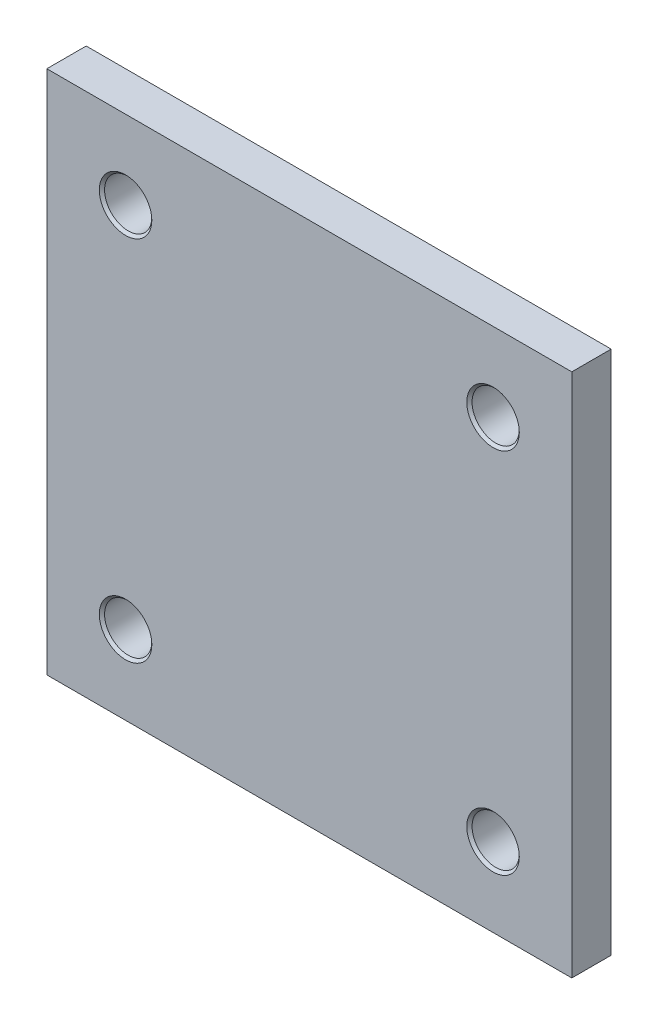
ISO-10303-21;
HEADER;
FILE_DESCRIPTION(('STEP AP214'),'2;1');
FILE_NAME('part.step','',(''),(''),'','','');
FILE_SCHEMA(('AUTOMOTIVE_DESIGN { 1 0 10303 214 1 1 1 1 }'));
ENDSEC;
DATA;
#1=APPLICATION_CONTEXT('core data for automotive mechanical design processes');
#2=APPLICATION_PROTOCOL_DEFINITION('international standard','automotive_design',2000,#1);
#3=PRODUCT_CONTEXT('',#1,'mechanical');
#4=PRODUCT('Part','Part','',(#3));
#5=PRODUCT_RELATED_PRODUCT_CATEGORY('part','',(#4));
#6=PRODUCT_DEFINITION_FORMATION('','',#4);
#7=PRODUCT_DEFINITION_CONTEXT('part definition',#1,'design');
#8=PRODUCT_DEFINITION('design','',#6,#7);
#9=PRODUCT_DEFINITION_SHAPE('','',#8);
#10=(LENGTH_UNIT() NAMED_UNIT(*) SI_UNIT(.MILLI.,.METRE.));
#11=(NAMED_UNIT(*) PLANE_ANGLE_UNIT() SI_UNIT($,.RADIAN.));
#12=(NAMED_UNIT(*) SI_UNIT($,.STERADIAN.) SOLID_ANGLE_UNIT());
#13=UNCERTAINTY_MEASURE_WITH_UNIT(LENGTH_MEASURE(1.E-05),#10,'distance_accuracy_value','');
#14=(GEOMETRIC_REPRESENTATION_CONTEXT(3) GLOBAL_UNCERTAINTY_ASSIGNED_CONTEXT((#13)) GLOBAL_UNIT_ASSIGNED_CONTEXT((#10,
#11,#12)) REPRESENTATION_CONTEXT('',''));
#15=CARTESIAN_POINT('',(0.,0.,0.));
#16=DIRECTION('',(0.,0.,1.));
#17=DIRECTION('',(1.,0.,0.));
#18=AXIS2_PLACEMENT_3D('',#15,#16,#17);
#19=CARTESIAN_POINT('',(200.,-200.,30.));
#20=DIRECTION('',(-1.,0.,0.));
#21=DIRECTION('',(0.,0.,1.));
#22=AXIS2_PLACEMENT_3D('',#19,#20,#21);
#23=PLANE('',#22);
#24=DIRECTION('',(0.,1.,0.));
#25=VECTOR('',#24,1.);
#26=CARTESIAN_POINT('',(200.,-200.,0.));
#27=LINE('',#26,#25);
#28=CARTESIAN_POINT('',(200.,-200.,0.));
#29=VERTEX_POINT('',#28);
#30=CARTESIAN_POINT('',(200.,200.,0.));
#31=VERTEX_POINT('',#30);
#32=EDGE_CURVE('E95',#29,#31,#27,.T.);
#33=ORIENTED_EDGE('',*,*,#32,.T.);
#34=DIRECTION('',(0.,0.,-1.));
#35=VECTOR('',#34,1.);
#36=CARTESIAN_POINT('',(200.,200.,30.));
#37=LINE('',#36,#35);
#38=CARTESIAN_POINT('',(200.,200.,30.));
#39=VERTEX_POINT('',#38);
#40=EDGE_CURVE('E11',#39,#31,#37,.T.);
#41=ORIENTED_EDGE('',*,*,#40,.F.);
#42=DIRECTION('',(0.,1.,0.));
#43=VECTOR('',#42,1.);
#44=CARTESIAN_POINT('',(200.,-200.,30.));
#45=LINE('',#44,#43);
#46=CARTESIAN_POINT('',(200.,-200.,30.));
#47=VERTEX_POINT('',#46);
#48=EDGE_CURVE('E83',#47,#39,#45,.T.);
#49=ORIENTED_EDGE('',*,*,#48,.F.);
#50=DIRECTION('',(0.,0.,-1.));
#51=VECTOR('',#50,1.);
#52=CARTESIAN_POINT('',(200.,-200.,30.));
#53=LINE('',#52,#51);
#54=EDGE_CURVE('E91',#47,#29,#53,.T.);
#55=ORIENTED_EDGE('',*,*,#54,.T.);
#56=EDGE_LOOP('',(#33,#41,#49,#55));
#57=FACE_BOUND('',#56,.T.);
#58=ADVANCED_FACE('F32',(#57),#23,.F.);
#59=CARTESIAN_POINT('',(-200.,200.,30.));
#60=DIRECTION('',(0.,-1.,0.));
#61=DIRECTION('',(0.,0.,-1.));
#62=AXIS2_PLACEMENT_3D('',#59,#60,#61);
#63=PLANE('',#62);
#64=DIRECTION('',(-1.,0.,0.));
#65=VECTOR('',#64,1.);
#66=CARTESIAN_POINT('',(-200.,200.,0.));
#67=LINE('',#66,#65);
#68=CARTESIAN_POINT('',(-200.,200.,0.));
#69=VERTEX_POINT('',#68);
#70=EDGE_CURVE('E87',#31,#69,#67,.T.);
#71=ORIENTED_EDGE('',*,*,#70,.T.);
#72=DIRECTION('',(0.,0.,-1.));
#73=VECTOR('',#72,1.);
#74=CARTESIAN_POINT('',(-200.,200.,30.));
#75=LINE('',#74,#73);
#76=CARTESIAN_POINT('',(-200.,200.,30.));
#77=VERTEX_POINT('',#76);
#78=EDGE_CURVE('E40',#77,#69,#75,.T.);
#79=ORIENTED_EDGE('',*,*,#78,.F.);
#80=DIRECTION('',(-1.,0.,0.));
#81=VECTOR('',#80,1.);
#82=CARTESIAN_POINT('',(-200.,200.,30.));
#83=LINE('',#82,#81);
#84=EDGE_CURVE('E78',#39,#77,#83,.T.);
#85=ORIENTED_EDGE('',*,*,#84,.F.);
#86=ORIENTED_EDGE('',*,*,#40,.T.);
#87=EDGE_LOOP('',(#71,#79,#85,#86));
#88=FACE_BOUND('',#87,.T.);
#89=ADVANCED_FACE('F86',(#88),#63,.F.);
#90=CARTESIAN_POINT('',(-200.,-200.,30.));
#91=DIRECTION('',(1.,0.,0.));
#92=DIRECTION('',(0.,0.,-1.));
#93=AXIS2_PLACEMENT_3D('',#90,#91,#92);
#94=PLANE('',#93);
#95=DIRECTION('',(0.,-1.,0.));
#96=VECTOR('',#95,1.);
#97=CARTESIAN_POINT('',(-200.,-200.,0.));
#98=LINE('',#97,#96);
#99=CARTESIAN_POINT('',(-200.,-200.,0.));
#100=VERTEX_POINT('',#99);
#101=EDGE_CURVE('E65',#69,#100,#98,.T.);
#102=ORIENTED_EDGE('',*,*,#101,.T.);
#103=DIRECTION('',(0.,0.,-1.));
#104=VECTOR('',#103,1.);
#105=CARTESIAN_POINT('',(-200.,-200.,30.));
#106=LINE('',#105,#104);
#107=CARTESIAN_POINT('',(-200.,-200.,30.));
#108=VERTEX_POINT('',#107);
#109=EDGE_CURVE('E88',#108,#100,#106,.T.);
#110=ORIENTED_EDGE('',*,*,#109,.F.);
#111=DIRECTION('',(0.,-1.,0.));
#112=VECTOR('',#111,1.);
#113=CARTESIAN_POINT('',(-200.,-200.,30.));
#114=LINE('',#113,#112);
#115=EDGE_CURVE('E81',#77,#108,#114,.T.);
#116=ORIENTED_EDGE('',*,*,#115,.F.);
#117=ORIENTED_EDGE('',*,*,#78,.T.);
#118=EDGE_LOOP('',(#102,#110,#116,#117));
#119=FACE_BOUND('',#118,.T.);
#120=ADVANCED_FACE('F89',(#119),#94,.F.);
#121=CARTESIAN_POINT('',(-200.,-200.,30.));
#122=DIRECTION('',(0.,1.,0.));
#123=DIRECTION('',(0.,0.,1.));
#124=AXIS2_PLACEMENT_3D('',#121,#122,#123);
#125=PLANE('',#124);
#126=DIRECTION('',(1.,0.,0.));
#127=VECTOR('',#126,1.);
#128=CARTESIAN_POINT('',(-200.,-200.,0.));
#129=LINE('',#128,#127);
#130=EDGE_CURVE('E71',#100,#29,#129,.T.);
#131=ORIENTED_EDGE('',*,*,#130,.T.);
#132=ORIENTED_EDGE('',*,*,#54,.F.);
#133=DIRECTION('',(1.,0.,0.));
#134=VECTOR('',#133,1.);
#135=CARTESIAN_POINT('',(-200.,-200.,30.));
#136=LINE('',#135,#134);
#137=EDGE_CURVE('E48',#108,#47,#136,.T.);
#138=ORIENTED_EDGE('',*,*,#137,.F.);
#139=ORIENTED_EDGE('',*,*,#109,.T.);
#140=EDGE_LOOP('',(#131,#132,#138,#139));
#141=FACE_BOUND('',#140,.T.);
#142=ADVANCED_FACE('F103',(#141),#125,.F.);
#143=CARTESIAN_POINT('',(0.,0.,30.));
#144=DIRECTION('',(0.,0.,-1.));
#145=DIRECTION('',(-1.,0.,0.));
#146=AXIS2_PLACEMENT_3D('',#143,#144,#145);
#147=PLANE('',#146);
#148=CARTESIAN_POINT('',(140.,140.,30.));
#149=DIRECTION('',(0.,0.,1.));
#150=DIRECTION('',(1.,0.,0.));
#151=AXIS2_PLACEMENT_3D('',#148,#149,#150);
#152=CIRCLE('',#151,20.);
#153=CARTESIAN_POINT('',(160.,140.,30.));
#154=VERTEX_POINT('',#153);
#155=EDGE_CURVE('E150',#154,#154,#152,.T.);
#156=ORIENTED_EDGE('',*,*,#155,.F.);
#157=EDGE_LOOP('',(#156));
#158=FACE_BOUND('',#157,.T.);
#159=CARTESIAN_POINT('',(-140.,140.,30.));
#160=DIRECTION('',(0.,0.,1.));
#161=DIRECTION('',(1.,0.,0.));
#162=AXIS2_PLACEMENT_3D('',#159,#160,#161);
#163=CIRCLE('',#162,20.);
#164=CARTESIAN_POINT('',(-120.,140.,30.));
#165=VERTEX_POINT('',#164);
#166=EDGE_CURVE('E138',#165,#165,#163,.T.);
#167=ORIENTED_EDGE('',*,*,#166,.F.);
#168=EDGE_LOOP('',(#167));
#169=FACE_BOUND('',#168,.T.);
#170=CARTESIAN_POINT('',(-140.,-140.,30.));
#171=DIRECTION('',(0.,0.,1.));
#172=DIRECTION('',(1.,0.,0.));
#173=AXIS2_PLACEMENT_3D('',#170,#171,#172);
#174=CIRCLE('',#173,20.);
#175=CARTESIAN_POINT('',(-120.,-140.,30.));
#176=VERTEX_POINT('',#175);
#177=EDGE_CURVE('E126',#176,#176,#174,.T.);
#178=ORIENTED_EDGE('',*,*,#177,.F.);
#179=EDGE_LOOP('',(#178));
#180=FACE_BOUND('',#179,.T.);
#181=CARTESIAN_POINT('',(140.,-140.,30.));
#182=DIRECTION('',(0.,0.,1.));
#183=DIRECTION('',(1.,0.,0.));
#184=AXIS2_PLACEMENT_3D('',#181,#182,#183);
#185=CIRCLE('',#184,20.);
#186=CARTESIAN_POINT('',(160.,-140.,30.));
#187=VERTEX_POINT('',#186);
#188=EDGE_CURVE('E114',#187,#187,#185,.T.);
#189=ORIENTED_EDGE('',*,*,#188,.F.);
#190=EDGE_LOOP('',(#189));
#191=FACE_BOUND('',#190,.T.);
#192=ORIENTED_EDGE('',*,*,#48,.T.);
#193=ORIENTED_EDGE('',*,*,#84,.T.);
#194=ORIENTED_EDGE('',*,*,#115,.T.);
#195=ORIENTED_EDGE('',*,*,#137,.T.);
#196=EDGE_LOOP('',(#192,#193,#194,#195));
#197=FACE_BOUND('',#196,.T.);
#198=ADVANCED_FACE('F79',(#158,#169,#180,#191,#197),#147,.F.);
#199=CARTESIAN_POINT('',(0.,0.,0.));
#200=DIRECTION('',(0.,0.,-1.));
#201=DIRECTION('',(-1.,0.,0.));
#202=AXIS2_PLACEMENT_3D('',#199,#200,#201);
#203=PLANE('',#202);
#204=CARTESIAN_POINT('',(140.,140.,0.));
#205=DIRECTION('',(0.,0.,1.));
#206=DIRECTION('',(1.,0.,0.));
#207=AXIS2_PLACEMENT_3D('',#204,#205,#206);
#208=CIRCLE('',#207,20.);
#209=CARTESIAN_POINT('',(160.,140.,0.));
#210=VERTEX_POINT('',#209);
#211=EDGE_CURVE('E153',#210,#210,#208,.T.);
#212=ORIENTED_EDGE('',*,*,#211,.T.);
#213=EDGE_LOOP('',(#212));
#214=FACE_BOUND('',#213,.T.);
#215=CARTESIAN_POINT('',(-140.,140.,0.));
#216=DIRECTION('',(0.,0.,1.));
#217=DIRECTION('',(1.,0.,0.));
#218=AXIS2_PLACEMENT_3D('',#215,#216,#217);
#219=CIRCLE('',#218,20.);
#220=CARTESIAN_POINT('',(-120.,140.,0.));
#221=VERTEX_POINT('',#220);
#222=EDGE_CURVE('E141',#221,#221,#219,.T.);
#223=ORIENTED_EDGE('',*,*,#222,.T.);
#224=EDGE_LOOP('',(#223));
#225=FACE_BOUND('',#224,.T.);
#226=CARTESIAN_POINT('',(-140.,-140.,0.));
#227=DIRECTION('',(0.,0.,1.));
#228=DIRECTION('',(1.,0.,0.));
#229=AXIS2_PLACEMENT_3D('',#226,#227,#228);
#230=CIRCLE('',#229,20.);
#231=CARTESIAN_POINT('',(-120.,-140.,0.));
#232=VERTEX_POINT('',#231);
#233=EDGE_CURVE('E129',#232,#232,#230,.T.);
#234=ORIENTED_EDGE('',*,*,#233,.T.);
#235=EDGE_LOOP('',(#234));
#236=FACE_BOUND('',#235,.T.);
#237=CARTESIAN_POINT('',(140.,-140.,0.));
#238=DIRECTION('',(0.,0.,1.));
#239=DIRECTION('',(1.,0.,0.));
#240=AXIS2_PLACEMENT_3D('',#237,#238,#239);
#241=CIRCLE('',#240,20.);
#242=CARTESIAN_POINT('',(160.,-140.,0.));
#243=VERTEX_POINT('',#242);
#244=EDGE_CURVE('E117',#243,#243,#241,.T.);
#245=ORIENTED_EDGE('',*,*,#244,.T.);
#246=EDGE_LOOP('',(#245));
#247=FACE_BOUND('',#246,.T.);
#248=ORIENTED_EDGE('',*,*,#32,.F.);
#249=ORIENTED_EDGE('',*,*,#130,.F.);
#250=ORIENTED_EDGE('',*,*,#101,.F.);
#251=ORIENTED_EDGE('',*,*,#70,.F.);
#252=EDGE_LOOP('',(#248,#249,#250,#251));
#253=FACE_BOUND('',#252,.T.);
#254=ADVANCED_FACE('F106',(#214,#225,#236,#247,#253),#203,.T.);
#255=CARTESIAN_POINT('',(140.,-140.,2.));
#256=DIRECTION('',(0.,0.,-1.));
#257=DIRECTION('',(-1.,0.,0.));
#258=AXIS2_PLACEMENT_3D('',#255,#256,#257);
#259=CONICAL_SURFACE('',#258,18.,0.78539816339745);
#260=ORIENTED_EDGE('',*,*,#244,.F.);
#261=EDGE_LOOP('',(#260));
#262=FACE_BOUND('',#261,.T.);
#263=CARTESIAN_POINT('',(140.,-140.,2.));
#264=DIRECTION('',(0.,0.,1.));
#265=DIRECTION('',(1.,0.,0.));
#266=AXIS2_PLACEMENT_3D('',#263,#264,#265);
#267=CIRCLE('',#266,18.);
#268=CARTESIAN_POINT('',(158.,-140.,2.));
#269=VERTEX_POINT('',#268);
#270=EDGE_CURVE('E98',#269,#269,#267,.T.);
#271=ORIENTED_EDGE('',*,*,#270,.T.);
#272=EDGE_LOOP('',(#271));
#273=FACE_BOUND('',#272,.T.);
#274=ADVANCED_FACE('F200',(#262,#273),#259,.F.);
#275=CARTESIAN_POINT('',(140.,-140.,30.));
#276=DIRECTION('',(0.,0.,1.));
#277=DIRECTION('',(1.,0.,0.));
#278=AXIS2_PLACEMENT_3D('',#275,#276,#277);
#279=CYLINDRICAL_SURFACE('',#278,18.);
#280=ORIENTED_EDGE('',*,*,#270,.F.);
#281=EDGE_LOOP('',(#280));
#282=FACE_BOUND('',#281,.T.);
#283=CARTESIAN_POINT('',(140.,-140.,28.));
#284=DIRECTION('',(0.,0.,1.));
#285=DIRECTION('',(1.,0.,0.));
#286=AXIS2_PLACEMENT_3D('',#283,#284,#285);
#287=CIRCLE('',#286,18.);
#288=CARTESIAN_POINT('',(158.,-140.,28.));
#289=VERTEX_POINT('',#288);
#290=EDGE_CURVE('E111',#289,#289,#287,.T.);
#291=ORIENTED_EDGE('',*,*,#290,.T.);
#292=EDGE_LOOP('',(#291));
#293=FACE_BOUND('',#292,.T.);
#294=ADVANCED_FACE('F190',(#282,#293),#279,.F.);
#295=CARTESIAN_POINT('',(140.,-140.,30.));
#296=DIRECTION('',(0.,0.,1.));
#297=DIRECTION('',(1.,0.,0.));
#298=AXIS2_PLACEMENT_3D('',#295,#296,#297);
#299=CONICAL_SURFACE('',#298,20.,0.785398163397451);
#300=ORIENTED_EDGE('',*,*,#290,.F.);
#301=EDGE_LOOP('',(#300));
#302=FACE_BOUND('',#301,.T.);
#303=ORIENTED_EDGE('',*,*,#188,.T.);
#304=EDGE_LOOP('',(#303));
#305=FACE_BOUND('',#304,.T.);
#306=ADVANCED_FACE('F187',(#302,#305),#299,.F.);
#307=CARTESIAN_POINT('',(-140.,-140.,2.));
#308=DIRECTION('',(0.,0.,-1.));
#309=DIRECTION('',(-1.,0.,0.));
#310=AXIS2_PLACEMENT_3D('',#307,#308,#309);
#311=CONICAL_SURFACE('',#310,18.,0.78539816339745);
#312=ORIENTED_EDGE('',*,*,#233,.F.);
#313=EDGE_LOOP('',(#312));
#314=FACE_BOUND('',#313,.T.);
#315=CARTESIAN_POINT('',(-140.,-140.,2.));
#316=DIRECTION('',(0.,0.,1.));
#317=DIRECTION('',(1.,0.,0.));
#318=AXIS2_PLACEMENT_3D('',#315,#316,#317);
#319=CIRCLE('',#318,18.);
#320=CARTESIAN_POINT('',(-122.,-140.,2.));
#321=VERTEX_POINT('',#320);
#322=EDGE_CURVE('E120',#321,#321,#319,.T.);
#323=ORIENTED_EDGE('',*,*,#322,.T.);
#324=EDGE_LOOP('',(#323));
#325=FACE_BOUND('',#324,.T.);
#326=ADVANCED_FACE('F189',(#314,#325),#311,.F.);
#327=CARTESIAN_POINT('',(-140.,-140.,30.));
#328=DIRECTION('',(0.,0.,1.));
#329=DIRECTION('',(1.,0.,0.));
#330=AXIS2_PLACEMENT_3D('',#327,#328,#329);
#331=CYLINDRICAL_SURFACE('',#330,18.);
#332=ORIENTED_EDGE('',*,*,#322,.F.);
#333=EDGE_LOOP('',(#332));
#334=FACE_BOUND('',#333,.T.);
#335=CARTESIAN_POINT('',(-140.,-140.,28.));
#336=DIRECTION('',(0.,0.,1.));
#337=DIRECTION('',(1.,0.,0.));
#338=AXIS2_PLACEMENT_3D('',#335,#336,#337);
#339=CIRCLE('',#338,18.);
#340=CARTESIAN_POINT('',(-122.,-140.,28.));
#341=VERTEX_POINT('',#340);
#342=EDGE_CURVE('E123',#341,#341,#339,.T.);
#343=ORIENTED_EDGE('',*,*,#342,.T.);
#344=EDGE_LOOP('',(#343));
#345=FACE_BOUND('',#344,.T.);
#346=ADVANCED_FACE('F197',(#334,#345),#331,.F.);
#347=CARTESIAN_POINT('',(-140.,-140.,30.));
#348=DIRECTION('',(0.,0.,1.));
#349=DIRECTION('',(1.,0.,0.));
#350=AXIS2_PLACEMENT_3D('',#347,#348,#349);
#351=CONICAL_SURFACE('',#350,20.,0.785398163397451);
#352=ORIENTED_EDGE('',*,*,#342,.F.);
#353=EDGE_LOOP('',(#352));
#354=FACE_BOUND('',#353,.T.);
#355=ORIENTED_EDGE('',*,*,#177,.T.);
#356=EDGE_LOOP('',(#355));
#357=FACE_BOUND('',#356,.T.);
#358=ADVANCED_FACE('F251',(#354,#357),#351,.F.);
#359=CARTESIAN_POINT('',(-140.,140.,2.));
#360=DIRECTION('',(0.,0.,-1.));
#361=DIRECTION('',(-1.,0.,0.));
#362=AXIS2_PLACEMENT_3D('',#359,#360,#361);
#363=CONICAL_SURFACE('',#362,18.,0.78539816339745);
#364=ORIENTED_EDGE('',*,*,#222,.F.);
#365=EDGE_LOOP('',(#364));
#366=FACE_BOUND('',#365,.T.);
#367=CARTESIAN_POINT('',(-140.,140.,2.));
#368=DIRECTION('',(0.,0.,1.));
#369=DIRECTION('',(1.,0.,0.));
#370=AXIS2_PLACEMENT_3D('',#367,#368,#369);
#371=CIRCLE('',#370,18.);
#372=CARTESIAN_POINT('',(-122.,140.,2.));
#373=VERTEX_POINT('',#372);
#374=EDGE_CURVE('E132',#373,#373,#371,.T.);
#375=ORIENTED_EDGE('',*,*,#374,.T.);
#376=EDGE_LOOP('',(#375));
#377=FACE_BOUND('',#376,.T.);
#378=ADVANCED_FACE('F261',(#366,#377),#363,.F.);
#379=CARTESIAN_POINT('',(-140.,140.,30.));
#380=DIRECTION('',(0.,0.,1.));
#381=DIRECTION('',(1.,0.,0.));
#382=AXIS2_PLACEMENT_3D('',#379,#380,#381);
#383=CYLINDRICAL_SURFACE('',#382,18.);
#384=ORIENTED_EDGE('',*,*,#374,.F.);
#385=EDGE_LOOP('',(#384));
#386=FACE_BOUND('',#385,.T.);
#387=CARTESIAN_POINT('',(-140.,140.,28.));
#388=DIRECTION('',(0.,0.,1.));
#389=DIRECTION('',(1.,0.,0.));
#390=AXIS2_PLACEMENT_3D('',#387,#388,#389);
#391=CIRCLE('',#390,18.);
#392=CARTESIAN_POINT('',(-122.,140.,28.));
#393=VERTEX_POINT('',#392);
#394=EDGE_CURVE('E135',#393,#393,#391,.T.);
#395=ORIENTED_EDGE('',*,*,#394,.T.);
#396=EDGE_LOOP('',(#395));
#397=FACE_BOUND('',#396,.T.);
#398=ADVANCED_FACE('F271',(#386,#397),#383,.F.);
#399=CARTESIAN_POINT('',(-140.,140.,30.));
#400=DIRECTION('',(0.,0.,1.));
#401=DIRECTION('',(1.,0.,0.));
#402=AXIS2_PLACEMENT_3D('',#399,#400,#401);
#403=CONICAL_SURFACE('',#402,20.,0.785398163397451);
#404=ORIENTED_EDGE('',*,*,#394,.F.);
#405=EDGE_LOOP('',(#404));
#406=FACE_BOUND('',#405,.T.);
#407=ORIENTED_EDGE('',*,*,#166,.T.);
#408=EDGE_LOOP('',(#407));
#409=FACE_BOUND('',#408,.T.);
#410=ADVANCED_FACE('F163',(#406,#409),#403,.F.);
#411=CARTESIAN_POINT('',(140.,140.,2.));
#412=DIRECTION('',(0.,0.,-1.));
#413=DIRECTION('',(-1.,0.,0.));
#414=AXIS2_PLACEMENT_3D('',#411,#412,#413);
#415=CONICAL_SURFACE('',#414,18.,0.785398163397443);
#416=ORIENTED_EDGE('',*,*,#211,.F.);
#417=EDGE_LOOP('',(#416));
#418=FACE_BOUND('',#417,.T.);
#419=CARTESIAN_POINT('',(140.,140.,2.));
#420=DIRECTION('',(0.,0.,1.));
#421=DIRECTION('',(1.,0.,0.));
#422=AXIS2_PLACEMENT_3D('',#419,#420,#421);
#423=CIRCLE('',#422,18.);
#424=CARTESIAN_POINT('',(158.,140.,2.));
#425=VERTEX_POINT('',#424);
#426=EDGE_CURVE('E144',#425,#425,#423,.T.);
#427=ORIENTED_EDGE('',*,*,#426,.T.);
#428=EDGE_LOOP('',(#427));
#429=FACE_BOUND('',#428,.T.);
#430=ADVANCED_FACE('F159',(#418,#429),#415,.F.);
#431=CARTESIAN_POINT('',(140.,140.,30.));
#432=DIRECTION('',(0.,0.,1.));
#433=DIRECTION('',(1.,0.,0.));
#434=AXIS2_PLACEMENT_3D('',#431,#432,#433);
#435=CYLINDRICAL_SURFACE('',#434,18.);
#436=ORIENTED_EDGE('',*,*,#426,.F.);
#437=EDGE_LOOP('',(#436));
#438=FACE_BOUND('',#437,.T.);
#439=CARTESIAN_POINT('',(140.,140.,28.));
#440=DIRECTION('',(0.,0.,1.));
#441=DIRECTION('',(1.,0.,0.));
#442=AXIS2_PLACEMENT_3D('',#439,#440,#441);
#443=CIRCLE('',#442,18.);
#444=CARTESIAN_POINT('',(158.,140.,28.));
#445=VERTEX_POINT('',#444);
#446=EDGE_CURVE('E147',#445,#445,#443,.T.);
#447=ORIENTED_EDGE('',*,*,#446,.T.);
#448=EDGE_LOOP('',(#447));
#449=FACE_BOUND('',#448,.T.);
#450=ADVANCED_FACE('F162',(#438,#449),#435,.F.);
#451=CARTESIAN_POINT('',(140.,140.,30.));
#452=DIRECTION('',(0.,0.,1.));
#453=DIRECTION('',(1.,0.,0.));
#454=AXIS2_PLACEMENT_3D('',#451,#452,#453);
#455=CONICAL_SURFACE('',#454,20.,0.785398163397451);
#456=ORIENTED_EDGE('',*,*,#446,.F.);
#457=EDGE_LOOP('',(#456));
#458=FACE_BOUND('',#457,.T.);
#459=ORIENTED_EDGE('',*,*,#155,.T.);
#460=EDGE_LOOP('',(#459));
#461=FACE_BOUND('',#460,.T.);
#462=ADVANCED_FACE('F169',(#458,#461),#455,.F.);
#463=CLOSED_SHELL('',(#58,#89,#120,#142,#198,#254,#274,#294,#306,#326,#346,#358,#378,#398,#410,
#430,#450,#462));
#464=MANIFOLD_SOLID_BREP('B2',#463);
#465=ADVANCED_BREP_SHAPE_REPRESENTATION('',(#18,#464),#14);
#466=SHAPE_DEFINITION_REPRESENTATION(#9,#465);
ENDSEC;
END-ISO-10303-21;
